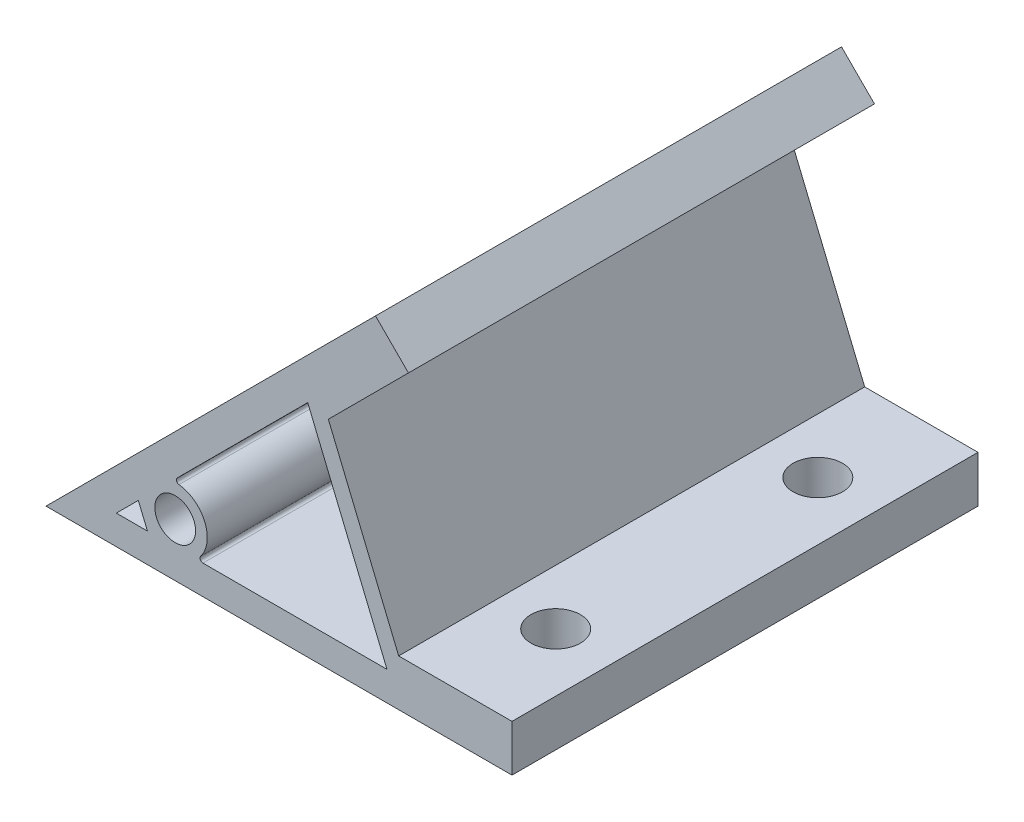
ISO-10303-21;
HEADER;
FILE_DESCRIPTION(('STEP AP214'),'2;1');
FILE_NAME('part.step','',(''),(''),'','','');
FILE_SCHEMA(('AUTOMOTIVE_DESIGN { 1 0 10303 214 1 1 1 1 }'));
ENDSEC;
DATA;
#1=APPLICATION_CONTEXT('core data for automotive mechanical design processes');
#2=APPLICATION_PROTOCOL_DEFINITION('international standard','automotive_design',2000,#1);
#3=PRODUCT_CONTEXT('',#1,'mechanical');
#4=PRODUCT('Part','Part','',(#3));
#5=PRODUCT_RELATED_PRODUCT_CATEGORY('part','',(#4));
#6=PRODUCT_DEFINITION_FORMATION('','',#4);
#7=PRODUCT_DEFINITION_CONTEXT('part definition',#1,'design');
#8=PRODUCT_DEFINITION('design','',#6,#7);
#9=PRODUCT_DEFINITION_SHAPE('','',#8);
#10=(LENGTH_UNIT() NAMED_UNIT(*) SI_UNIT(.MILLI.,.METRE.));
#11=(NAMED_UNIT(*) PLANE_ANGLE_UNIT() SI_UNIT($,.RADIAN.));
#12=(NAMED_UNIT(*) SI_UNIT($,.STERADIAN.) SOLID_ANGLE_UNIT());
#13=UNCERTAINTY_MEASURE_WITH_UNIT(LENGTH_MEASURE(1.E-05),#10,'distance_accuracy_value','');
#14=(GEOMETRIC_REPRESENTATION_CONTEXT(3) GLOBAL_UNCERTAINTY_ASSIGNED_CONTEXT((#13)) GLOBAL_UNIT_ASSIGNED_CONTEXT((#10,
#11,#12)) REPRESENTATION_CONTEXT('',''));
#15=CARTESIAN_POINT('',(0.,0.,0.));
#16=DIRECTION('',(0.,0.,1.));
#17=DIRECTION('',(1.,0.,0.));
#18=AXIS2_PLACEMENT_3D('',#15,#16,#17);
#19=CARTESIAN_POINT('',(80.,0.,40.));
#20=DIRECTION('',(0.,0.,1.));
#21=DIRECTION('',(1.,0.,0.));
#22=AXIS2_PLACEMENT_3D('',#19,#20,#21);
#23=PLANE('',#22);
#24=CARTESIAN_POINT('',(22.1846771867485,9.15647377294881,40.));
#25=DIRECTION('',(0.,0.,1.));
#26=DIRECTION('',(1.,0.,0.));
#27=AXIS2_PLACEMENT_3D('',#24,#25,#26);
#28=CIRCLE('',#27,3.5);
#29=CARTESIAN_POINT('',(25.6846771867485,9.15647377294881,40.));
#30=VERTEX_POINT('',#29);
#31=EDGE_CURVE('E201',#30,#30,#28,.T.);
#32=ORIENTED_EDGE('',*,*,#31,.F.);
#33=EDGE_LOOP('',(#32));
#34=FACE_BOUND('',#33,.T.);
#35=DIRECTION('',(1.,0.,0.));
#36=VECTOR('',#35,1.);
#37=CARTESIAN_POINT('',(0.,0.,40.));
#38=LINE('',#37,#36);
#39=CARTESIAN_POINT('',(0.,0.,40.));
#40=VERTEX_POINT('',#39);
#41=CARTESIAN_POINT('',(80.,0.,40.));
#42=VERTEX_POINT('',#41);
#43=EDGE_CURVE('E231',#40,#42,#38,.T.);
#44=ORIENTED_EDGE('',*,*,#43,.T.);
#45=DIRECTION('',(0.,1.,0.));
#46=VECTOR('',#45,1.);
#47=CARTESIAN_POINT('',(80.,0.,40.));
#48=LINE('',#47,#46);
#49=CARTESIAN_POINT('',(80.,8.,40.));
#50=VERTEX_POINT('',#49);
#51=EDGE_CURVE('E234',#42,#50,#48,.T.);
#52=ORIENTED_EDGE('',*,*,#51,.T.);
#53=DIRECTION('',(-1.,0.,0.));
#54=VECTOR('',#53,1.);
#55=CARTESIAN_POINT('',(60.5474313182664,8.,40.));
#56=LINE('',#55,#54);
#57=CARTESIAN_POINT('',(60.5474313182664,8.,40.));
#58=VERTEX_POINT('',#57);
#59=EDGE_CURVE('E237',#50,#58,#56,.T.);
#60=ORIENTED_EDGE('',*,*,#59,.T.);
#61=DIRECTION('',(-0.382683432365087,0.923879532511288,0.));
#62=VECTOR('',#61,1.);
#63=CARTESIAN_POINT('',(60.5474313182664,8.,40.));
#64=LINE('',#63,#62);
#65=CARTESIAN_POINT('',(48.4703535180654,37.1566450190806,40.));
#66=VERTEX_POINT('',#65);
#67=EDGE_CURVE('E239',#58,#66,#64,.T.);
#68=ORIENTED_EDGE('',*,*,#67,.T.);
#69=DIRECTION('',(0.707106781186547,0.707106781186548,0.));
#70=VECTOR('',#69,1.);
#71=CARTESIAN_POINT('',(48.4703535180654,37.1566450190806,40.));
#72=LINE('',#71,#70);
#73=CARTESIAN_POINT('',(62.2253967444162,50.9116882454314,40.));
#74=VERTEX_POINT('',#73);
#75=EDGE_CURVE('E241',#66,#74,#72,.T.);
#76=ORIENTED_EDGE('',*,*,#75,.T.);
#77=DIRECTION('',(-0.707106781186549,0.707106781186546,0.));
#78=VECTOR('',#77,1.);
#79=CARTESIAN_POINT('',(62.2253967444162,50.9116882454314,40.));
#80=LINE('',#79,#78);
#81=CARTESIAN_POINT('',(56.5685424949237,56.5685424949239,40.));
#82=VERTEX_POINT('',#81);
#83=EDGE_CURVE('E243',#74,#82,#80,.T.);
#84=ORIENTED_EDGE('',*,*,#83,.T.);
#85=DIRECTION('',(-0.707106781186546,-0.707106781186549,0.));
#86=VECTOR('',#85,1.);
#87=CARTESIAN_POINT('',(0.,0.,40.));
#88=LINE('',#87,#86);
#89=EDGE_CURVE('E245',#82,#40,#88,.T.);
#90=ORIENTED_EDGE('',*,*,#89,.T.);
#91=EDGE_LOOP('',(#44,#52,#60,#68,#76,#84,#90));
#92=FACE_BOUND('',#91,.T.);
#93=DIRECTION('',(-0.382683432365087,0.923879532511288,0.));
#94=VECTOR('',#93,1.);
#95=CARTESIAN_POINT('',(15.8476713770087,8.77660356514327,40.));
#96=LINE('',#95,#94);
#97=CARTESIAN_POINT('',(17.4119917933976,5.,40.));
#98=VERTEX_POINT('',#97);
#99=CARTESIAN_POINT('',(15.8476713770087,8.77660356514326,40.));
#100=VERTEX_POINT('',#99);
#101=EDGE_CURVE('E209',#98,#100,#96,.T.);
#102=ORIENTED_EDGE('',*,*,#101,.F.);
#103=DIRECTION('',(1.,0.,0.));
#104=VECTOR('',#103,1.);
#105=CARTESIAN_POINT('',(12.0710678118655,5.,40.));
#106=LINE('',#105,#104);
#107=CARTESIAN_POINT('',(12.0710678118655,5.,40.));
#108=VERTEX_POINT('',#107);
#109=EDGE_CURVE('E207',#108,#98,#106,.T.);
#110=ORIENTED_EDGE('',*,*,#109,.F.);
#111=DIRECTION('',(-0.707106781186543,-0.707106781186552,0.));
#112=VECTOR('',#111,1.);
#113=CARTESIAN_POINT('',(12.0710678118655,5.,40.));
#114=LINE('',#113,#112);
#115=EDGE_CURVE('E213',#100,#108,#114,.T.);
#116=ORIENTED_EDGE('',*,*,#115,.F.);
#117=EDGE_LOOP('',(#102,#110,#116));
#118=FACE_BOUND('',#117,.T.);
#119=DIRECTION('',(1.,0.,0.));
#120=VECTOR('',#119,1.);
#121=CARTESIAN_POINT('',(26.9417981172838,5.,40.));
#122=LINE('',#121,#120);
#123=CARTESIAN_POINT('',(26.9417981172838,5.,40.));
#124=VERTEX_POINT('',#123);
#125=CARTESIAN_POINT('',(58.5428954045085,5.,40.));
#126=VERTEX_POINT('',#125);
#127=EDGE_CURVE('E156',#124,#126,#122,.T.);
#128=ORIENTED_EDGE('',*,*,#127,.F.);
#129=CARTESIAN_POINT('',(26.9417981172838,5.5,40.));
#130=DIRECTION('',(0.,0.,1.));
#131=DIRECTION('',(-1.,0.,0.));
#132=AXIS2_PLACEMENT_3D('',#129,#130,#131);
#133=CIRCLE('',#132,0.5);
#134=CARTESIAN_POINT('',(26.5453713730726,5.80470614774571,40.));
#135=VERTEX_POINT('',#134);
#136=EDGE_CURVE('E148',#135,#124,#133,.T.);
#137=ORIENTED_EDGE('',*,*,#136,.F.);
#138=CARTESIAN_POINT('',(22.1846771867485,9.15647377294881,40.));
#139=DIRECTION('',(0.,0.,-1.));
#140=DIRECTION('',(1.,0.,0.));
#141=AXIS2_PLACEMENT_3D('',#138,#139,#140);
#142=CIRCLE('',#141,5.5);
#143=CARTESIAN_POINT('',(22.8337204048437,14.6180434100627,40.));
#144=VERTEX_POINT('',#143);
#145=EDGE_CURVE('E178',#144,#135,#142,.T.);
#146=ORIENTED_EDGE('',*,*,#145,.F.);
#147=CARTESIAN_POINT('',(22.8927243337614,15.1145497407095,40.));
#148=DIRECTION('',(0.,0.,1.));
#149=DIRECTION('',(1.,0.,0.));
#150=AXIS2_PLACEMENT_3D('',#147,#148,#149);
#151=CIRCLE('',#150,0.500000000000001);
#152=CARTESIAN_POINT('',(22.5391709431682,15.4681031313028,40.));
#153=VERTEX_POINT('',#152);
#154=EDGE_CURVE('E176',#153,#144,#151,.T.);
#155=ORIENTED_EDGE('',*,*,#154,.F.);
#156=DIRECTION('',(-0.707106781186546,-0.707106781186549,0.));
#157=VECTOR('',#156,1.);
#158=CARTESIAN_POINT('',(22.5391709431682,15.4681031313028,40.));
#159=LINE('',#158,#157);
#160=CARTESIAN_POINT('',(44.9316122367555,37.8605444248902,40.));
#161=VERTEX_POINT('',#160);
#162=EDGE_CURVE('E171',#161,#153,#159,.T.);
#163=ORIENTED_EDGE('',*,*,#162,.F.);
#164=DIRECTION('',(-0.382683432365087,0.923879532511288,0.));
#165=VECTOR('',#164,1.);
#166=CARTESIAN_POINT('',(58.5428954045085,5.,40.));
#167=LINE('',#166,#165);
#168=EDGE_CURVE('E169',#126,#161,#167,.T.);
#169=ORIENTED_EDGE('',*,*,#168,.F.);
#170=EDGE_LOOP('',(#128,#137,#146,#155,#163,#169));
#171=FACE_BOUND('',#170,.T.);
#172=ADVANCED_FACE('F33',(#34,#92,#118,#171),#23,.T.);
#173=CARTESIAN_POINT('',(80.,0.,-40.));
#174=DIRECTION('',(0.,0.,1.));
#175=DIRECTION('',(1.,0.,0.));
#176=AXIS2_PLACEMENT_3D('',#173,#174,#175);
#177=PLANE('',#176);
#178=CARTESIAN_POINT('',(22.1846771867485,9.15647377294881,-40.));
#179=DIRECTION('',(0.,0.,1.));
#180=DIRECTION('',(1.,0.,0.));
#181=AXIS2_PLACEMENT_3D('',#178,#179,#180);
#182=CIRCLE('',#181,3.5);
#183=CARTESIAN_POINT('',(25.6846771867485,9.15647377294881,-40.));
#184=VERTEX_POINT('',#183);
#185=EDGE_CURVE('E164',#184,#184,#182,.T.);
#186=ORIENTED_EDGE('',*,*,#185,.T.);
#187=EDGE_LOOP('',(#186));
#188=FACE_BOUND('',#187,.T.);
#189=DIRECTION('',(1.,0.,0.));
#190=VECTOR('',#189,1.);
#191=CARTESIAN_POINT('',(0.,0.,-40.));
#192=LINE('',#191,#190);
#193=CARTESIAN_POINT('',(0.,0.,-40.));
#194=VERTEX_POINT('',#193);
#195=CARTESIAN_POINT('',(80.,0.,-40.));
#196=VERTEX_POINT('',#195);
#197=EDGE_CURVE('E230',#194,#196,#192,.T.);
#198=ORIENTED_EDGE('',*,*,#197,.F.);
#199=DIRECTION('',(-0.707106781186546,-0.707106781186549,0.));
#200=VECTOR('',#199,1.);
#201=CARTESIAN_POINT('',(0.,0.,-40.));
#202=LINE('',#201,#200);
#203=CARTESIAN_POINT('',(56.5685424949237,56.5685424949239,-40.));
#204=VERTEX_POINT('',#203);
#205=EDGE_CURVE('E235',#204,#194,#202,.T.);
#206=ORIENTED_EDGE('',*,*,#205,.F.);
#207=DIRECTION('',(-0.707106781186549,0.707106781186546,0.));
#208=VECTOR('',#207,1.);
#209=CARTESIAN_POINT('',(62.2253967444162,50.9116882454314,-40.));
#210=LINE('',#209,#208);
#211=CARTESIAN_POINT('',(62.2253967444162,50.9116882454314,-40.));
#212=VERTEX_POINT('',#211);
#213=EDGE_CURVE('E258',#212,#204,#210,.T.);
#214=ORIENTED_EDGE('',*,*,#213,.F.);
#215=DIRECTION('',(0.707106781186547,0.707106781186548,0.));
#216=VECTOR('',#215,1.);
#217=CARTESIAN_POINT('',(48.4703535180654,37.1566450190806,-40.));
#218=LINE('',#217,#216);
#219=CARTESIAN_POINT('',(48.4703535180654,37.1566450190806,-40.));
#220=VERTEX_POINT('',#219);
#221=EDGE_CURVE('E256',#220,#212,#218,.T.);
#222=ORIENTED_EDGE('',*,*,#221,.F.);
#223=DIRECTION('',(-0.382683432365087,0.923879532511288,0.));
#224=VECTOR('',#223,1.);
#225=CARTESIAN_POINT('',(60.5474313182664,8.,-40.));
#226=LINE('',#225,#224);
#227=CARTESIAN_POINT('',(60.5474313182664,8.,-40.));
#228=VERTEX_POINT('',#227);
#229=EDGE_CURVE('E254',#228,#220,#226,.T.);
#230=ORIENTED_EDGE('',*,*,#229,.F.);
#231=DIRECTION('',(-1.,0.,0.));
#232=VECTOR('',#231,1.);
#233=CARTESIAN_POINT('',(60.5474313182664,8.,-40.));
#234=LINE('',#233,#232);
#235=CARTESIAN_POINT('',(80.,8.,-40.));
#236=VERTEX_POINT('',#235);
#237=EDGE_CURVE('E252',#236,#228,#234,.T.);
#238=ORIENTED_EDGE('',*,*,#237,.F.);
#239=DIRECTION('',(0.,1.,0.));
#240=VECTOR('',#239,1.);
#241=CARTESIAN_POINT('',(80.,0.,-40.));
#242=LINE('',#241,#240);
#243=EDGE_CURVE('E250',#196,#236,#242,.T.);
#244=ORIENTED_EDGE('',*,*,#243,.F.);
#245=EDGE_LOOP('',(#198,#206,#214,#222,#230,#238,#244));
#246=FACE_BOUND('',#245,.T.);
#247=DIRECTION('',(1.,0.,0.));
#248=VECTOR('',#247,1.);
#249=CARTESIAN_POINT('',(12.0710678118655,5.,-40.));
#250=LINE('',#249,#248);
#251=CARTESIAN_POINT('',(12.0710678118655,5.,-40.));
#252=VERTEX_POINT('',#251);
#253=CARTESIAN_POINT('',(17.4119917933976,5.,-40.));
#254=VERTEX_POINT('',#253);
#255=EDGE_CURVE('E204',#252,#254,#250,.T.);
#256=ORIENTED_EDGE('',*,*,#255,.T.);
#257=DIRECTION('',(-0.382683432365087,0.923879532511288,0.));
#258=VECTOR('',#257,1.);
#259=CARTESIAN_POINT('',(15.8476713770087,8.77660356514327,-40.));
#260=LINE('',#259,#258);
#261=CARTESIAN_POINT('',(15.8476713770087,8.77660356514327,-40.));
#262=VERTEX_POINT('',#261);
#263=EDGE_CURVE('E218',#254,#262,#260,.T.);
#264=ORIENTED_EDGE('',*,*,#263,.T.);
#265=DIRECTION('',(-0.707106781186543,-0.707106781186552,0.));
#266=VECTOR('',#265,1.);
#267=CARTESIAN_POINT('',(12.0710678118655,5.,-40.));
#268=LINE('',#267,#266);
#269=EDGE_CURVE('E210',#262,#252,#268,.T.);
#270=ORIENTED_EDGE('',*,*,#269,.T.);
#271=EDGE_LOOP('',(#256,#264,#270));
#272=FACE_BOUND('',#271,.T.);
#273=CARTESIAN_POINT('',(26.9417981172838,5.5,-40.));
#274=DIRECTION('',(0.,0.,1.));
#275=DIRECTION('',(-1.,0.,0.));
#276=AXIS2_PLACEMENT_3D('',#273,#274,#275);
#277=CIRCLE('',#276,0.5);
#278=CARTESIAN_POINT('',(26.5453713730726,5.8047061477457,-40.));
#279=VERTEX_POINT('',#278);
#280=CARTESIAN_POINT('',(26.9417981172838,5.,-40.));
#281=VERTEX_POINT('',#280);
#282=EDGE_CURVE('E58',#279,#281,#277,.T.);
#283=ORIENTED_EDGE('',*,*,#282,.T.);
#284=DIRECTION('',(1.,0.,0.));
#285=VECTOR('',#284,1.);
#286=CARTESIAN_POINT('',(26.9417981172838,5.,-40.));
#287=LINE('',#286,#285);
#288=CARTESIAN_POINT('',(58.5428954045085,5.,-40.));
#289=VERTEX_POINT('',#288);
#290=EDGE_CURVE('E163',#281,#289,#287,.T.);
#291=ORIENTED_EDGE('',*,*,#290,.T.);
#292=DIRECTION('',(-0.382683432365087,0.923879532511288,0.));
#293=VECTOR('',#292,1.);
#294=CARTESIAN_POINT('',(58.5428954045085,5.,-40.));
#295=LINE('',#294,#293);
#296=CARTESIAN_POINT('',(44.9316122367555,37.8605444248902,-40.));
#297=VERTEX_POINT('',#296);
#298=EDGE_CURVE('E183',#289,#297,#295,.T.);
#299=ORIENTED_EDGE('',*,*,#298,.T.);
#300=DIRECTION('',(-0.707106781186546,-0.707106781186549,0.));
#301=VECTOR('',#300,1.);
#302=CARTESIAN_POINT('',(22.5391709431682,15.4681031313028,-40.));
#303=LINE('',#302,#301);
#304=CARTESIAN_POINT('',(22.5391709431682,15.4681031313028,-40.));
#305=VERTEX_POINT('',#304);
#306=EDGE_CURVE('E186',#297,#305,#303,.T.);
#307=ORIENTED_EDGE('',*,*,#306,.T.);
#308=CARTESIAN_POINT('',(22.8927243337614,15.1145497407095,-40.));
#309=DIRECTION('',(0.,0.,1.));
#310=DIRECTION('',(1.,0.,0.));
#311=AXIS2_PLACEMENT_3D('',#308,#309,#310);
#312=CIRCLE('',#311,0.500000000000001);
#313=CARTESIAN_POINT('',(22.8337204048437,14.6180434100628,-40.));
#314=VERTEX_POINT('',#313);
#315=EDGE_CURVE('E189',#305,#314,#312,.T.);
#316=ORIENTED_EDGE('',*,*,#315,.T.);
#317=CARTESIAN_POINT('',(22.1846771867485,9.15647377294881,-40.));
#318=DIRECTION('',(0.,0.,-1.));
#319=DIRECTION('',(1.,0.,0.));
#320=AXIS2_PLACEMENT_3D('',#317,#318,#319);
#321=CIRCLE('',#320,5.5);
#322=EDGE_CURVE('E157',#314,#279,#321,.T.);
#323=ORIENTED_EDGE('',*,*,#322,.T.);
#324=EDGE_LOOP('',(#283,#291,#299,#307,#316,#323));
#325=FACE_BOUND('',#324,.T.);
#326=ADVANCED_FACE('F319',(#188,#246,#272,#325),#177,.F.);
#327=CARTESIAN_POINT('',(0.,0.,40.));
#328=DIRECTION('',(0.,1.,0.));
#329=DIRECTION('',(0.,0.,1.));
#330=AXIS2_PLACEMENT_3D('',#327,#328,#329);
#331=PLANE('',#330);
#332=CARTESIAN_POINT('',(70.,0.,-22.5));
#333=DIRECTION('',(0.,-1.,0.));
#334=DIRECTION('',(0.,0.,1.));
#335=AXIS2_PLACEMENT_3D('',#332,#333,#334);
#336=CIRCLE('',#335,4.25);
#337=CARTESIAN_POINT('',(70.,0.,-18.25));
#338=VERTEX_POINT('',#337);
#339=EDGE_CURVE('E290',#338,#338,#336,.T.);
#340=ORIENTED_EDGE('',*,*,#339,.F.);
#341=EDGE_LOOP('',(#340));
#342=FACE_BOUND('',#341,.T.);
#343=CARTESIAN_POINT('',(70.,0.,22.5));
#344=DIRECTION('',(0.,-1.,0.));
#345=DIRECTION('',(0.,0.,-1.));
#346=AXIS2_PLACEMENT_3D('',#343,#344,#345);
#347=CIRCLE('',#346,4.25);
#348=CARTESIAN_POINT('',(70.,0.,18.25));
#349=VERTEX_POINT('',#348);
#350=EDGE_CURVE('E279',#349,#349,#347,.T.);
#351=ORIENTED_EDGE('',*,*,#350,.F.);
#352=EDGE_LOOP('',(#351));
#353=FACE_BOUND('',#352,.T.);
#354=ORIENTED_EDGE('',*,*,#197,.T.);
#355=DIRECTION('',(0.,0.,-1.));
#356=VECTOR('',#355,1.);
#357=CARTESIAN_POINT('',(80.,0.,40.));
#358=LINE('',#357,#356);
#359=EDGE_CURVE('E11',#42,#196,#358,.T.);
#360=ORIENTED_EDGE('',*,*,#359,.F.);
#361=ORIENTED_EDGE('',*,*,#43,.F.);
#362=DIRECTION('',(0.,0.,-1.));
#363=VECTOR('',#362,1.);
#364=CARTESIAN_POINT('',(0.,0.,40.));
#365=LINE('',#364,#363);
#366=EDGE_CURVE('E247',#40,#194,#365,.T.);
#367=ORIENTED_EDGE('',*,*,#366,.T.);
#368=EDGE_LOOP('',(#354,#360,#361,#367));
#369=FACE_BOUND('',#368,.T.);
#370=ADVANCED_FACE('F35',(#342,#353,#369),#331,.F.);
#371=CARTESIAN_POINT('',(80.,0.,40.));
#372=DIRECTION('',(-1.,0.,0.));
#373=DIRECTION('',(0.,0.,1.));
#374=AXIS2_PLACEMENT_3D('',#371,#372,#373);
#375=PLANE('',#374);
#376=ORIENTED_EDGE('',*,*,#243,.T.);
#377=DIRECTION('',(0.,0.,-1.));
#378=VECTOR('',#377,1.);
#379=CARTESIAN_POINT('',(80.,8.,40.));
#380=LINE('',#379,#378);
#381=EDGE_CURVE('E42',#50,#236,#380,.T.);
#382=ORIENTED_EDGE('',*,*,#381,.F.);
#383=ORIENTED_EDGE('',*,*,#51,.F.);
#384=ORIENTED_EDGE('',*,*,#359,.T.);
#385=EDGE_LOOP('',(#376,#382,#383,#384));
#386=FACE_BOUND('',#385,.T.);
#387=ADVANCED_FACE('F350',(#386),#375,.F.);
#388=CARTESIAN_POINT('',(60.5474313182664,8.,40.));
#389=DIRECTION('',(0.,-1.,0.));
#390=DIRECTION('',(0.,0.,-1.));
#391=AXIS2_PLACEMENT_3D('',#388,#389,#390);
#392=PLANE('',#391);
#393=CARTESIAN_POINT('',(70.,8.,-22.5));
#394=DIRECTION('',(0.,-1.,0.));
#395=DIRECTION('',(0.,0.,-1.));
#396=AXIS2_PLACEMENT_3D('',#393,#394,#395);
#397=CIRCLE('',#396,4.25);
#398=CARTESIAN_POINT('',(70.,8.,-26.75));
#399=VERTEX_POINT('',#398);
#400=EDGE_CURVE('E37',#399,#399,#397,.T.);
#401=ORIENTED_EDGE('',*,*,#400,.T.);
#402=EDGE_LOOP('',(#401));
#403=FACE_BOUND('',#402,.T.);
#404=CARTESIAN_POINT('',(70.,8.,22.5));
#405=DIRECTION('',(0.,-1.,0.));
#406=DIRECTION('',(0.,0.,-1.));
#407=AXIS2_PLACEMENT_3D('',#404,#405,#406);
#408=CIRCLE('',#407,4.25);
#409=CARTESIAN_POINT('',(70.,8.,18.25));
#410=VERTEX_POINT('',#409);
#411=EDGE_CURVE('E276',#410,#410,#408,.T.);
#412=ORIENTED_EDGE('',*,*,#411,.T.);
#413=EDGE_LOOP('',(#412));
#414=FACE_BOUND('',#413,.T.);
#415=ORIENTED_EDGE('',*,*,#237,.T.);
#416=DIRECTION('',(0.,0.,-1.));
#417=VECTOR('',#416,1.);
#418=CARTESIAN_POINT('',(60.5474313182664,8.,40.));
#419=LINE('',#418,#417);
#420=EDGE_CURVE('E272',#58,#228,#419,.T.);
#421=ORIENTED_EDGE('',*,*,#420,.F.);
#422=ORIENTED_EDGE('',*,*,#59,.F.);
#423=ORIENTED_EDGE('',*,*,#381,.T.);
#424=EDGE_LOOP('',(#415,#421,#422,#423));
#425=FACE_BOUND('',#424,.T.);
#426=ADVANCED_FACE('F347',(#403,#414,#425),#392,.F.);
#427=CARTESIAN_POINT('',(60.5474313182664,8.,40.));
#428=DIRECTION('',(-0.923879532511288,-0.382683432365087,0.));
#429=DIRECTION('',(0.382683432365087,-0.923879532511288,0.));
#430=AXIS2_PLACEMENT_3D('',#427,#428,#429);
#431=PLANE('',#430);
#432=ORIENTED_EDGE('',*,*,#229,.T.);
#433=DIRECTION('',(0.,0.,-1.));
#434=VECTOR('',#433,1.);
#435=CARTESIAN_POINT('',(48.4703535180654,37.1566450190806,40.));
#436=LINE('',#435,#434);
#437=EDGE_CURVE('E269',#66,#220,#436,.T.);
#438=ORIENTED_EDGE('',*,*,#437,.F.);
#439=ORIENTED_EDGE('',*,*,#67,.F.);
#440=ORIENTED_EDGE('',*,*,#420,.T.);
#441=EDGE_LOOP('',(#432,#438,#439,#440));
#442=FACE_BOUND('',#441,.T.);
#443=ADVANCED_FACE('F343',(#442),#431,.F.);
#444=CARTESIAN_POINT('',(48.4703535180654,37.1566450190806,40.));
#445=DIRECTION('',(-0.707106781186548,0.707106781186547,0.));
#446=DIRECTION('',(-0.707106781186547,-0.707106781186548,0.));
#447=AXIS2_PLACEMENT_3D('',#444,#445,#446);
#448=PLANE('',#447);
#449=CARTESIAN_POINT('',(55.1543289325507,43.840620433566,-22.5));
#450=DIRECTION('',(-0.707106781186548,0.707106781186547,0.));
#451=DIRECTION('',(-0.707106781186547,-0.707106781186548,0.));
#452=AXIS2_PLACEMENT_3D('',#449,#450,#451);
#453=CIRCLE('',#452,4.25000000000001);
#454=CARTESIAN_POINT('',(52.1491251125079,40.8354166135231,-22.5));
#455=VERTEX_POINT('',#454);
#456=EDGE_CURVE('E283',#455,#455,#453,.T.);
#457=ORIENTED_EDGE('',*,*,#456,.T.);
#458=EDGE_LOOP('',(#457));
#459=FACE_BOUND('',#458,.T.);
#460=CARTESIAN_POINT('',(55.1543289325507,43.840620433566,22.5));
#461=DIRECTION('',(-0.707106781186548,0.707106781186547,0.));
#462=DIRECTION('',(-0.707106781186547,-0.707106781186548,0.));
#463=AXIS2_PLACEMENT_3D('',#460,#461,#462);
#464=CIRCLE('',#463,4.25000000000001);
#465=CARTESIAN_POINT('',(52.1491251125079,40.8354166135231,22.5));
#466=VERTEX_POINT('',#465);
#467=EDGE_CURVE('E181',#466,#466,#464,.T.);
#468=ORIENTED_EDGE('',*,*,#467,.T.);
#469=EDGE_LOOP('',(#468));
#470=FACE_BOUND('',#469,.T.);
#471=ORIENTED_EDGE('',*,*,#221,.T.);
#472=DIRECTION('',(0.,0.,-1.));
#473=VECTOR('',#472,1.);
#474=CARTESIAN_POINT('',(62.2253967444162,50.9116882454314,40.));
#475=LINE('',#474,#473);
#476=EDGE_CURVE('E266',#74,#212,#475,.T.);
#477=ORIENTED_EDGE('',*,*,#476,.F.);
#478=ORIENTED_EDGE('',*,*,#75,.F.);
#479=ORIENTED_EDGE('',*,*,#437,.T.);
#480=EDGE_LOOP('',(#471,#477,#478,#479));
#481=FACE_BOUND('',#480,.T.);
#482=ADVANCED_FACE('F300',(#459,#470,#481),#448,.F.);
#483=CARTESIAN_POINT('',(62.2253967444162,50.9116882454314,40.));
#484=DIRECTION('',(-0.707106781186546,-0.707106781186549,0.));
#485=DIRECTION('',(0.707106781186549,-0.707106781186546,0.));
#486=AXIS2_PLACEMENT_3D('',#483,#484,#485);
#487=PLANE('',#486);
#488=ORIENTED_EDGE('',*,*,#213,.T.);
#489=DIRECTION('',(0.,0.,-1.));
#490=VECTOR('',#489,1.);
#491=CARTESIAN_POINT('',(56.5685424949237,56.5685424949239,40.));
#492=LINE('',#491,#490);
#493=EDGE_CURVE('E263',#82,#204,#492,.T.);
#494=ORIENTED_EDGE('',*,*,#493,.F.);
#495=ORIENTED_EDGE('',*,*,#83,.F.);
#496=ORIENTED_EDGE('',*,*,#476,.T.);
#497=EDGE_LOOP('',(#488,#494,#495,#496));
#498=FACE_BOUND('',#497,.T.);
#499=ADVANCED_FACE('F336',(#498),#487,.F.);
#500=CARTESIAN_POINT('',(0.,0.,40.));
#501=DIRECTION('',(0.707106781186549,-0.707106781186546,0.));
#502=DIRECTION('',(0.707106781186546,0.707106781186549,0.));
#503=AXIS2_PLACEMENT_3D('',#500,#501,#502);
#504=PLANE('',#503);
#505=CARTESIAN_POINT('',(49.4974746830583,49.4974746830584,-22.5));
#506=DIRECTION('',(-0.707106781186549,0.707106781186546,0.));
#507=DIRECTION('',(0.707106781186546,0.707106781186549,0.));
#508=AXIS2_PLACEMENT_3D('',#505,#506,#507);
#509=CIRCLE('',#508,4.25000000000001);
#510=CARTESIAN_POINT('',(52.5026785031011,52.5026785031013,-22.5));
#511=VERTEX_POINT('',#510);
#512=EDGE_CURVE('E278',#511,#511,#509,.T.);
#513=ORIENTED_EDGE('',*,*,#512,.F.);
#514=EDGE_LOOP('',(#513));
#515=FACE_BOUND('',#514,.T.);
#516=CARTESIAN_POINT('',(49.4974746830583,49.4974746830584,22.5));
#517=DIRECTION('',(-0.707106781186549,0.707106781186546,0.));
#518=DIRECTION('',(-0.707106781186546,-0.707106781186549,0.));
#519=AXIS2_PLACEMENT_3D('',#516,#517,#518);
#520=CIRCLE('',#519,4.25000000000001);
#521=CARTESIAN_POINT('',(46.4922708630154,46.4922708630156,22.5));
#522=VERTEX_POINT('',#521);
#523=EDGE_CURVE('E295',#522,#522,#520,.T.);
#524=ORIENTED_EDGE('',*,*,#523,.F.);
#525=EDGE_LOOP('',(#524));
#526=FACE_BOUND('',#525,.T.);
#527=ORIENTED_EDGE('',*,*,#205,.T.);
#528=ORIENTED_EDGE('',*,*,#366,.F.);
#529=ORIENTED_EDGE('',*,*,#89,.F.);
#530=ORIENTED_EDGE('',*,*,#493,.T.);
#531=EDGE_LOOP('',(#527,#528,#529,#530));
#532=FACE_BOUND('',#531,.T.);
#533=ADVANCED_FACE('F333',(#515,#526,#532),#504,.F.);
#534=CARTESIAN_POINT('',(12.0710678118655,5.,40.));
#535=DIRECTION('',(0.,1.,0.));
#536=DIRECTION('',(0.,0.,1.));
#537=AXIS2_PLACEMENT_3D('',#534,#535,#536);
#538=PLANE('',#537);
#539=ORIENTED_EDGE('',*,*,#255,.F.);
#540=DIRECTION('',(0.,0.,-1.));
#541=VECTOR('',#540,1.);
#542=CARTESIAN_POINT('',(12.0710678118655,5.,40.));
#543=LINE('',#542,#541);
#544=EDGE_CURVE('E215',#108,#252,#543,.T.);
#545=ORIENTED_EDGE('',*,*,#544,.F.);
#546=ORIENTED_EDGE('',*,*,#109,.T.);
#547=DIRECTION('',(0.,0.,-1.));
#548=VECTOR('',#547,1.);
#549=CARTESIAN_POINT('',(17.4119917933976,5.,40.));
#550=LINE('',#549,#548);
#551=EDGE_CURVE('E227',#98,#254,#550,.T.);
#552=ORIENTED_EDGE('',*,*,#551,.T.);
#553=EDGE_LOOP('',(#539,#545,#546,#552));
#554=FACE_BOUND('',#553,.T.);
#555=ADVANCED_FACE('F330',(#554),#538,.T.);
#556=CARTESIAN_POINT('',(15.8476713770087,8.77660356514327,40.));
#557=DIRECTION('',(-0.923879532511288,-0.382683432365087,0.));
#558=DIRECTION('',(0.382683432365087,-0.923879532511288,0.));
#559=AXIS2_PLACEMENT_3D('',#556,#557,#558);
#560=PLANE('',#559);
#561=ORIENTED_EDGE('',*,*,#263,.F.);
#562=ORIENTED_EDGE('',*,*,#551,.F.);
#563=ORIENTED_EDGE('',*,*,#101,.T.);
#564=DIRECTION('',(0.,0.,-1.));
#565=VECTOR('',#564,1.);
#566=CARTESIAN_POINT('',(15.8476713770087,8.77660356514327,40.));
#567=LINE('',#566,#565);
#568=EDGE_CURVE('E225',#100,#262,#567,.T.);
#569=ORIENTED_EDGE('',*,*,#568,.T.);
#570=EDGE_LOOP('',(#561,#562,#563,#569));
#571=FACE_BOUND('',#570,.T.);
#572=ADVANCED_FACE('F388',(#571),#560,.T.);
#573=CARTESIAN_POINT('',(12.0710678118655,5.,40.));
#574=DIRECTION('',(0.707106781186552,-0.707106781186543,0.));
#575=DIRECTION('',(0.707106781186543,0.707106781186552,0.));
#576=AXIS2_PLACEMENT_3D('',#573,#574,#575);
#577=PLANE('',#576);
#578=ORIENTED_EDGE('',*,*,#269,.F.);
#579=ORIENTED_EDGE('',*,*,#568,.F.);
#580=ORIENTED_EDGE('',*,*,#115,.T.);
#581=ORIENTED_EDGE('',*,*,#544,.T.);
#582=EDGE_LOOP('',(#578,#579,#580,#581));
#583=FACE_BOUND('',#582,.T.);
#584=ADVANCED_FACE('F394',(#583),#577,.T.);
#585=CARTESIAN_POINT('',(22.1846771867485,9.15647377294881,40.));
#586=DIRECTION('',(0.,0.,-1.));
#587=DIRECTION('',(-1.,0.,0.));
#588=AXIS2_PLACEMENT_3D('',#585,#586,#587);
#589=CYLINDRICAL_SURFACE('',#588,3.5);
#590=ORIENTED_EDGE('',*,*,#31,.T.);
#591=EDGE_LOOP('',(#590));
#592=FACE_BOUND('',#591,.T.);
#593=ORIENTED_EDGE('',*,*,#185,.F.);
#594=EDGE_LOOP('',(#593));
#595=FACE_BOUND('',#594,.T.);
#596=ADVANCED_FACE('F396',(#592,#595),#589,.F.);
#597=CARTESIAN_POINT('',(26.9417981172838,5.5,40.));
#598=DIRECTION('',(0.,0.,-1.));
#599=DIRECTION('',(-1.,0.,0.));
#600=AXIS2_PLACEMENT_3D('',#597,#598,#599);
#601=CYLINDRICAL_SURFACE('',#600,0.5);
#602=ORIENTED_EDGE('',*,*,#282,.F.);
#603=DIRECTION('',(0.,0.,-1.));
#604=VECTOR('',#603,1.);
#605=CARTESIAN_POINT('',(26.5453713730726,5.80470614774571,40.));
#606=LINE('',#605,#604);
#607=EDGE_CURVE('E152',#135,#279,#606,.T.);
#608=ORIENTED_EDGE('',*,*,#607,.F.);
#609=ORIENTED_EDGE('',*,*,#136,.T.);
#610=DIRECTION('',(0.,0.,-1.));
#611=VECTOR('',#610,1.);
#612=CARTESIAN_POINT('',(26.9417981172838,5.,40.));
#613=LINE('',#612,#611);
#614=EDGE_CURVE('E151',#124,#281,#613,.T.);
#615=ORIENTED_EDGE('',*,*,#614,.T.);
#616=EDGE_LOOP('',(#602,#608,#609,#615));
#617=FACE_BOUND('',#616,.T.);
#618=ADVANCED_FACE('F150',(#617),#601,.F.);
#619=CARTESIAN_POINT('',(26.9417981172838,5.,40.));
#620=DIRECTION('',(0.,1.,0.));
#621=DIRECTION('',(-1.,0.,0.));
#622=AXIS2_PLACEMENT_3D('',#619,#620,#621);
#623=PLANE('',#622);
#624=ORIENTED_EDGE('',*,*,#290,.F.);
#625=ORIENTED_EDGE('',*,*,#614,.F.);
#626=ORIENTED_EDGE('',*,*,#127,.T.);
#627=DIRECTION('',(0.,0.,-1.));
#628=VECTOR('',#627,1.);
#629=CARTESIAN_POINT('',(58.5428954045085,5.,40.));
#630=LINE('',#629,#628);
#631=EDGE_CURVE('E165',#126,#289,#630,.T.);
#632=ORIENTED_EDGE('',*,*,#631,.T.);
#633=EDGE_LOOP('',(#624,#625,#626,#632));
#634=FACE_BOUND('',#633,.T.);
#635=ADVANCED_FACE('F160',(#634),#623,.T.);
#636=CARTESIAN_POINT('',(58.5428954045085,5.,40.));
#637=DIRECTION('',(-0.923879532511288,-0.382683432365087,0.));
#638=DIRECTION('',(0.382683432365087,-0.923879532511288,0.));
#639=AXIS2_PLACEMENT_3D('',#636,#637,#638);
#640=PLANE('',#639);
#641=ORIENTED_EDGE('',*,*,#298,.F.);
#642=ORIENTED_EDGE('',*,*,#631,.F.);
#643=ORIENTED_EDGE('',*,*,#168,.T.);
#644=DIRECTION('',(0.,0.,-1.));
#645=VECTOR('',#644,1.);
#646=CARTESIAN_POINT('',(44.9316122367555,37.8605444248902,40.));
#647=LINE('',#646,#645);
#648=EDGE_CURVE('E198',#161,#297,#647,.T.);
#649=ORIENTED_EDGE('',*,*,#648,.T.);
#650=EDGE_LOOP('',(#641,#642,#643,#649));
#651=FACE_BOUND('',#650,.T.);
#652=ADVANCED_FACE('F409',(#651),#640,.T.);
#653=CARTESIAN_POINT('',(22.5391709431682,15.4681031313028,40.));
#654=DIRECTION('',(0.707106781186549,-0.707106781186546,0.));
#655=DIRECTION('',(0.707106781186546,0.707106781186549,0.));
#656=AXIS2_PLACEMENT_3D('',#653,#654,#655);
#657=PLANE('',#656);
#658=ORIENTED_EDGE('',*,*,#306,.F.);
#659=ORIENTED_EDGE('',*,*,#648,.F.);
#660=ORIENTED_EDGE('',*,*,#162,.T.);
#661=DIRECTION('',(0.,0.,-1.));
#662=VECTOR('',#661,1.);
#663=CARTESIAN_POINT('',(22.5391709431682,15.4681031313028,40.));
#664=LINE('',#663,#662);
#665=EDGE_CURVE('E196',#153,#305,#664,.T.);
#666=ORIENTED_EDGE('',*,*,#665,.T.);
#667=EDGE_LOOP('',(#658,#659,#660,#666));
#668=FACE_BOUND('',#667,.T.);
#669=ADVANCED_FACE('F412',(#668),#657,.T.);
#670=CARTESIAN_POINT('',(22.8927243337614,15.1145497407095,40.));
#671=DIRECTION('',(0.,0.,-1.));
#672=DIRECTION('',(-1.,0.,0.));
#673=AXIS2_PLACEMENT_3D('',#670,#671,#672);
#674=CYLINDRICAL_SURFACE('',#673,0.500000000000001);
#675=ORIENTED_EDGE('',*,*,#315,.F.);
#676=ORIENTED_EDGE('',*,*,#665,.F.);
#677=ORIENTED_EDGE('',*,*,#154,.T.);
#678=DIRECTION('',(0.,0.,-1.));
#679=VECTOR('',#678,1.);
#680=CARTESIAN_POINT('',(22.8337204048437,14.6180434100628,40.));
#681=LINE('',#680,#679);
#682=EDGE_CURVE('E50',#144,#314,#681,.T.);
#683=ORIENTED_EDGE('',*,*,#682,.T.);
#684=EDGE_LOOP('',(#675,#676,#677,#683));
#685=FACE_BOUND('',#684,.T.);
#686=ADVANCED_FACE('F316',(#685),#674,.F.);
#687=CARTESIAN_POINT('',(22.1846771867485,9.15647377294881,40.));
#688=DIRECTION('',(0.,0.,-1.));
#689=DIRECTION('',(-1.,0.,0.));
#690=AXIS2_PLACEMENT_3D('',#687,#688,#689);
#691=CYLINDRICAL_SURFACE('',#690,5.5);
#692=ORIENTED_EDGE('',*,*,#322,.F.);
#693=ORIENTED_EDGE('',*,*,#682,.F.);
#694=ORIENTED_EDGE('',*,*,#145,.T.);
#695=ORIENTED_EDGE('',*,*,#607,.T.);
#696=EDGE_LOOP('',(#692,#693,#694,#695));
#697=FACE_BOUND('',#696,.T.);
#698=ADVANCED_FACE('F306',(#697),#691,.T.);
#699=CARTESIAN_POINT('',(63.6396103067892,35.3553390593275,22.5));
#700=DIRECTION('',(-0.707106781186549,0.707106781186546,0.));
#701=DIRECTION('',(-0.707106781186546,-0.707106781186549,0.));
#702=AXIS2_PLACEMENT_3D('',#699,#700,#701);
#703=CYLINDRICAL_SURFACE('',#702,4.25000000000001);
#704=ORIENTED_EDGE('',*,*,#523,.T.);
#705=EDGE_LOOP('',(#704));
#706=FACE_BOUND('',#705,.T.);
#707=ORIENTED_EDGE('',*,*,#467,.F.);
#708=EDGE_LOOP('',(#707));
#709=FACE_BOUND('',#708,.T.);
#710=ADVANCED_FACE('F303',(#706,#709),#703,.F.);
#711=CARTESIAN_POINT('',(63.6396103067892,35.3553390593275,-22.5));
#712=DIRECTION('',(-0.707106781186549,0.707106781186546,0.));
#713=DIRECTION('',(-0.707106781186546,-0.707106781186549,0.));
#714=AXIS2_PLACEMENT_3D('',#711,#712,#713);
#715=CYLINDRICAL_SURFACE('',#714,4.25000000000001);
#716=ORIENTED_EDGE('',*,*,#512,.T.);
#717=EDGE_LOOP('',(#716));
#718=FACE_BOUND('',#717,.T.);
#719=ORIENTED_EDGE('',*,*,#456,.F.);
#720=EDGE_LOOP('',(#719));
#721=FACE_BOUND('',#720,.T.);
#722=ADVANCED_FACE('F305',(#718,#721),#715,.F.);
#723=CARTESIAN_POINT('',(70.,20.,22.5));
#724=DIRECTION('',(0.,-1.,0.));
#725=DIRECTION('',(0.,0.,-1.));
#726=AXIS2_PLACEMENT_3D('',#723,#724,#725);
#727=CYLINDRICAL_SURFACE('',#726,4.25);
#728=ORIENTED_EDGE('',*,*,#350,.T.);
#729=EDGE_LOOP('',(#728));
#730=FACE_BOUND('',#729,.T.);
#731=ORIENTED_EDGE('',*,*,#411,.F.);
#732=EDGE_LOOP('',(#731));
#733=FACE_BOUND('',#732,.T.);
#734=ADVANCED_FACE('F313',(#730,#733),#727,.F.);
#735=CARTESIAN_POINT('',(70.,20.,-22.5));
#736=DIRECTION('',(0.,-1.,0.));
#737=DIRECTION('',(0.,0.,-1.));
#738=AXIS2_PLACEMENT_3D('',#735,#736,#737);
#739=CYLINDRICAL_SURFACE('',#738,4.25);
#740=ORIENTED_EDGE('',*,*,#339,.T.);
#741=EDGE_LOOP('',(#740));
#742=FACE_BOUND('',#741,.T.);
#743=ORIENTED_EDGE('',*,*,#400,.F.);
#744=EDGE_LOOP('',(#743));
#745=FACE_BOUND('',#744,.T.);
#746=ADVANCED_FACE('F482',(#742,#745),#739,.F.);
#747=CLOSED_SHELL('',(#172,#326,#370,#387,#426,#443,#482,#499,#533,#555,#572,#584,#596,#618,
#635,#652,#669,#686,#698,#710,#722,#734,#746));
#748=MANIFOLD_SOLID_BREP('B2',#747);
#749=ADVANCED_BREP_SHAPE_REPRESENTATION('',(#18,#748),#14);
#750=SHAPE_DEFINITION_REPRESENTATION(#9,#749);
ENDSEC;
END-ISO-10303-21;
